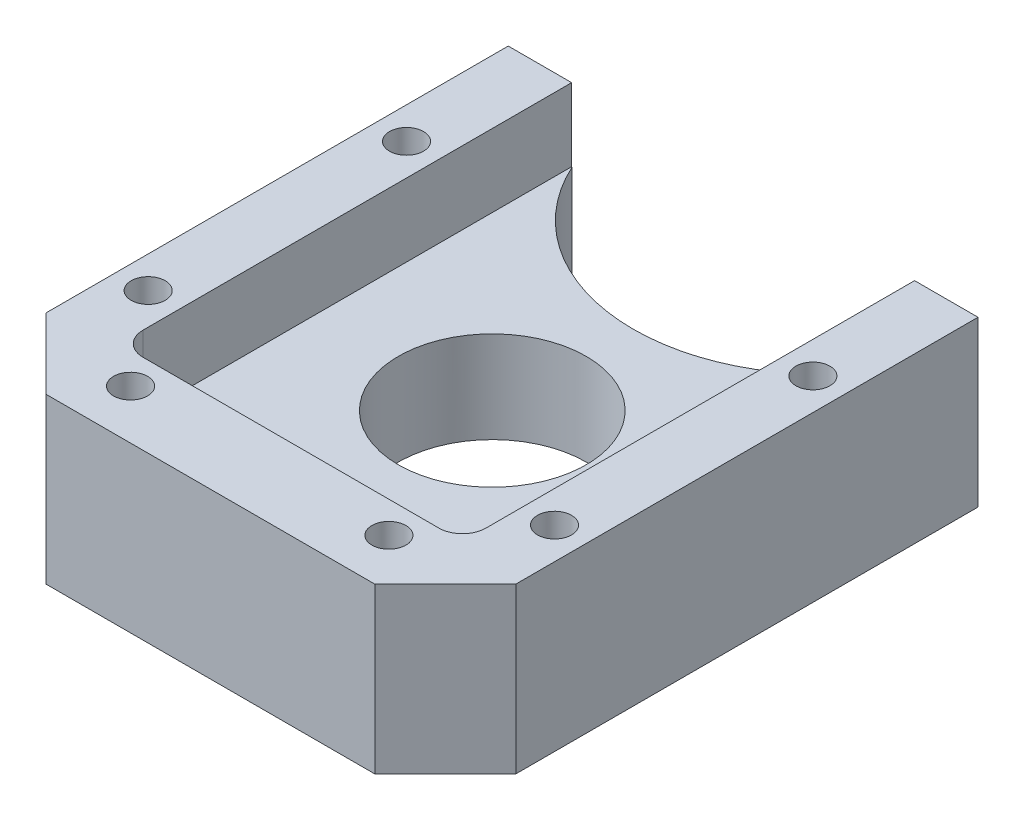
ISO-10303-21;
HEADER;
FILE_DESCRIPTION(('STEP AP214'),'2;1');
FILE_NAME('part.step','',(''),(''),'','','');
FILE_SCHEMA(('AUTOMOTIVE_DESIGN { 1 0 10303 214 1 1 1 1 }'));
ENDSEC;
DATA;
#1=APPLICATION_CONTEXT('core data for automotive mechanical design processes');
#2=APPLICATION_PROTOCOL_DEFINITION('international standard','automotive_design',2000,#1);
#3=PRODUCT_CONTEXT('',#1,'mechanical');
#4=PRODUCT('Part','Part','',(#3));
#5=PRODUCT_RELATED_PRODUCT_CATEGORY('part','',(#4));
#6=PRODUCT_DEFINITION_FORMATION('','',#4);
#7=PRODUCT_DEFINITION_CONTEXT('part definition',#1,'design');
#8=PRODUCT_DEFINITION('design','',#6,#7);
#9=PRODUCT_DEFINITION_SHAPE('','',#8);
#10=(LENGTH_UNIT() NAMED_UNIT(*) SI_UNIT(.MILLI.,.METRE.));
#11=(NAMED_UNIT(*) PLANE_ANGLE_UNIT() SI_UNIT($,.RADIAN.));
#12=(NAMED_UNIT(*) SI_UNIT($,.STERADIAN.) SOLID_ANGLE_UNIT());
#13=UNCERTAINTY_MEASURE_WITH_UNIT(LENGTH_MEASURE(1.E-05),#10,'distance_accuracy_value','');
#14=(GEOMETRIC_REPRESENTATION_CONTEXT(3) GLOBAL_UNCERTAINTY_ASSIGNED_CONTEXT((#13)) GLOBAL_UNIT_ASSIGNED_CONTEXT((#10,
#11,#12)) REPRESENTATION_CONTEXT('',''));
#15=CARTESIAN_POINT('',(0.,0.,0.));
#16=DIRECTION('',(0.,0.,1.));
#17=DIRECTION('',(1.,0.,0.));
#18=AXIS2_PLACEMENT_3D('',#15,#16,#17);
#19=CARTESIAN_POINT('',(0.,14.,-45.36));
#20=DIRECTION('',(0.,0.,-1.));
#21=DIRECTION('',(-1.,0.,0.));
#22=AXIS2_PLACEMENT_3D('',#19,#20,#21);
#23=PLANE('',#22);
#24=DIRECTION('',(0.,-1.,0.));
#25=VECTOR('',#24,1.);
#26=CARTESIAN_POINT('',(34.5571425767559,14.,-45.36));
#27=LINE('',#26,#25);
#28=CARTESIAN_POINT('',(34.5571425767559,7.8,-45.36));
#29=VERTEX_POINT('',#28);
#30=CARTESIAN_POINT('',(34.5571425767559,0.,-45.36));
#31=VERTEX_POINT('',#30);
#32=EDGE_CURVE('E147',#29,#31,#27,.T.);
#33=ORIENTED_EDGE('',*,*,#32,.F.);
#34=DIRECTION('',(-1.,0.,0.));
#35=VECTOR('',#34,1.);
#36=CARTESIAN_POINT('',(5.39999999999999,7.8,-45.36));
#37=LINE('',#36,#35);
#38=CARTESIAN_POINT('',(34.6,7.8,-45.36));
#39=VERTEX_POINT('',#38);
#40=EDGE_CURVE('E298',#39,#29,#37,.T.);
#41=ORIENTED_EDGE('',*,*,#40,.F.);
#42=DIRECTION('',(0.,1.,0.));
#43=VECTOR('',#42,1.);
#44=CARTESIAN_POINT('',(34.6,7.8,-45.36));
#45=LINE('',#44,#43);
#46=CARTESIAN_POINT('',(34.6,14.,-45.36));
#47=VERTEX_POINT('',#46);
#48=EDGE_CURVE('E183',#39,#47,#45,.T.);
#49=ORIENTED_EDGE('',*,*,#48,.T.);
#50=DIRECTION('',(1.,0.,0.));
#51=VECTOR('',#50,1.);
#52=CARTESIAN_POINT('',(0.,14.,-45.36));
#53=LINE('',#52,#51);
#54=CARTESIAN_POINT('',(40.,14.,-45.36));
#55=VERTEX_POINT('',#54);
#56=EDGE_CURVE('E199',#47,#55,#53,.T.);
#57=ORIENTED_EDGE('',*,*,#56,.T.);
#58=DIRECTION('',(0.,-1.,0.));
#59=VECTOR('',#58,1.);
#60=CARTESIAN_POINT('',(40.,14.,-45.36));
#61=LINE('',#60,#59);
#62=CARTESIAN_POINT('',(40.,0.,-45.36));
#63=VERTEX_POINT('',#62);
#64=EDGE_CURVE('E175',#55,#63,#61,.T.);
#65=ORIENTED_EDGE('',*,*,#64,.T.);
#66=DIRECTION('',(1.,0.,0.));
#67=VECTOR('',#66,1.);
#68=CARTESIAN_POINT('',(0.,0.,-45.36));
#69=LINE('',#68,#67);
#70=EDGE_CURVE('E167',#31,#63,#69,.T.);
#71=ORIENTED_EDGE('',*,*,#70,.F.);
#72=EDGE_LOOP('',(#33,#41,#49,#57,#65,#71));
#73=FACE_BOUND('',#72,.T.);
#74=ADVANCED_FACE('F46',(#73),#23,.T.);
#75=DIRECTION('',(0.,-1.,0.));
#76=VECTOR('',#75,1.);
#77=CARTESIAN_POINT('',(5.44285742324408,14.,-45.36));
#78=LINE('',#77,#76);
#79=CARTESIAN_POINT('',(5.44285742324408,0.,-45.36));
#80=VERTEX_POINT('',#79);
#81=CARTESIAN_POINT('',(5.44285742324408,7.8,-45.36));
#82=VERTEX_POINT('',#81);
#83=EDGE_CURVE('E160',#80,#82,#78,.F.);
#84=ORIENTED_EDGE('',*,*,#83,.F.);
#85=CARTESIAN_POINT('',(0.,0.,-45.36));
#86=VERTEX_POINT('',#85);
#87=EDGE_CURVE('E171',#86,#80,#69,.T.);
#88=ORIENTED_EDGE('',*,*,#87,.F.);
#89=DIRECTION('',(0.,-1.,0.));
#90=VECTOR('',#89,1.);
#91=CARTESIAN_POINT('',(0.,14.,-45.36));
#92=LINE('',#91,#90);
#93=CARTESIAN_POINT('',(0.,14.,-45.36));
#94=VERTEX_POINT('',#93);
#95=EDGE_CURVE('E200',#94,#86,#92,.T.);
#96=ORIENTED_EDGE('',*,*,#95,.F.);
#97=CARTESIAN_POINT('',(5.39999999999999,14.,-45.36));
#98=VERTEX_POINT('',#97);
#99=EDGE_CURVE('E308',#94,#98,#53,.T.);
#100=ORIENTED_EDGE('',*,*,#99,.T.);
#101=DIRECTION('',(0.,1.,0.));
#102=VECTOR('',#101,1.);
#103=CARTESIAN_POINT('',(5.39999999999999,7.8,-45.36));
#104=LINE('',#103,#102);
#105=CARTESIAN_POINT('',(5.39999999999999,7.8,-45.36));
#106=VERTEX_POINT('',#105);
#107=EDGE_CURVE('E178',#106,#98,#104,.T.);
#108=ORIENTED_EDGE('',*,*,#107,.F.);
#109=EDGE_CURVE('E292',#82,#106,#37,.T.);
#110=ORIENTED_EDGE('',*,*,#109,.F.);
#111=EDGE_LOOP('',(#84,#88,#96,#100,#108,#110));
#112=FACE_BOUND('',#111,.T.);
#113=ADVANCED_FACE('F348',(#112),#23,.T.);
#114=CARTESIAN_POINT('',(0.,14.,-45.36));
#115=DIRECTION('',(1.,0.,0.));
#116=DIRECTION('',(0.,0.,-1.));
#117=AXIS2_PLACEMENT_3D('',#114,#115,#116);
#118=PLANE('',#117);
#119=DIRECTION('',(0.,0.,1.));
#120=VECTOR('',#119,1.);
#121=CARTESIAN_POINT('',(0.,0.,-45.36));
#122=LINE('',#121,#120);
#123=CARTESIAN_POINT('',(0.,0.,-6.00000000000004));
#124=VERTEX_POINT('',#123);
#125=EDGE_CURVE('E195',#86,#124,#122,.T.);
#126=ORIENTED_EDGE('',*,*,#125,.T.);
#127=DIRECTION('',(0.,1.,0.));
#128=VECTOR('',#127,1.);
#129=CARTESIAN_POINT('',(0.,14.,-6.00000000000003));
#130=LINE('',#129,#128);
#131=CARTESIAN_POINT('',(0.,14.,-6.00000000000004));
#132=VERTEX_POINT('',#131);
#133=EDGE_CURVE('E235',#124,#132,#130,.T.);
#134=ORIENTED_EDGE('',*,*,#133,.T.);
#135=DIRECTION('',(0.,0.,1.));
#136=VECTOR('',#135,1.);
#137=CARTESIAN_POINT('',(0.,14.,-45.36));
#138=LINE('',#137,#136);
#139=EDGE_CURVE('E187',#94,#132,#138,.T.);
#140=ORIENTED_EDGE('',*,*,#139,.F.);
#141=ORIENTED_EDGE('',*,*,#95,.T.);
#142=EDGE_LOOP('',(#126,#134,#140,#141));
#143=FACE_BOUND('',#142,.T.);
#144=ADVANCED_FACE('F354',(#143),#118,.F.);
#145=CARTESIAN_POINT('',(0.,14.,0.));
#146=DIRECTION('',(0.,0.,-1.));
#147=DIRECTION('',(-1.,0.,0.));
#148=AXIS2_PLACEMENT_3D('',#145,#146,#147);
#149=PLANE('',#148);
#150=DIRECTION('',(1.,0.,0.));
#151=VECTOR('',#150,1.);
#152=CARTESIAN_POINT('',(0.,0.,0.));
#153=LINE('',#152,#151);
#154=CARTESIAN_POINT('',(6.,0.,0.));
#155=VERTEX_POINT('',#154);
#156=CARTESIAN_POINT('',(34.,0.,0.));
#157=VERTEX_POINT('',#156);
#158=EDGE_CURVE('E191',#155,#157,#153,.T.);
#159=ORIENTED_EDGE('',*,*,#158,.T.);
#160=DIRECTION('',(0.,1.,0.));
#161=VECTOR('',#160,1.);
#162=CARTESIAN_POINT('',(34.,14.,0.));
#163=LINE('',#162,#161);
#164=CARTESIAN_POINT('',(34.,14.,0.));
#165=VERTEX_POINT('',#164);
#166=EDGE_CURVE('E226',#157,#165,#163,.T.);
#167=ORIENTED_EDGE('',*,*,#166,.T.);
#168=DIRECTION('',(1.,0.,0.));
#169=VECTOR('',#168,1.);
#170=CARTESIAN_POINT('',(0.,14.,0.));
#171=LINE('',#170,#169);
#172=CARTESIAN_POINT('',(6.,14.,0.));
#173=VERTEX_POINT('',#172);
#174=EDGE_CURVE('E314',#173,#165,#171,.T.);
#175=ORIENTED_EDGE('',*,*,#174,.F.);
#176=DIRECTION('',(0.,-1.,0.));
#177=VECTOR('',#176,1.);
#178=CARTESIAN_POINT('',(6.,14.,0.));
#179=LINE('',#178,#177);
#180=EDGE_CURVE('E222',#173,#155,#179,.T.);
#181=ORIENTED_EDGE('',*,*,#180,.T.);
#182=EDGE_LOOP('',(#159,#167,#175,#181));
#183=FACE_BOUND('',#182,.T.);
#184=ADVANCED_FACE('F329',(#183),#149,.F.);
#185=CARTESIAN_POINT('',(40.,14.,-45.36));
#186=DIRECTION('',(1.,0.,0.));
#187=DIRECTION('',(0.,0.,-1.));
#188=AXIS2_PLACEMENT_3D('',#185,#186,#187);
#189=PLANE('',#188);
#190=DIRECTION('',(0.,0.,1.));
#191=VECTOR('',#190,1.);
#192=CARTESIAN_POINT('',(40.,14.,-45.36));
#193=LINE('',#192,#191);
#194=CARTESIAN_POINT('',(40.,14.,-6.00000000000002));
#195=VERTEX_POINT('',#194);
#196=EDGE_CURVE('E311',#55,#195,#193,.T.);
#197=ORIENTED_EDGE('',*,*,#196,.T.);
#198=DIRECTION('',(0.,-1.,0.));
#199=VECTOR('',#198,1.);
#200=CARTESIAN_POINT('',(40.,0.,-6.00000000000001));
#201=LINE('',#200,#199);
#202=CARTESIAN_POINT('',(40.,0.,-6.00000000000002));
#203=VERTEX_POINT('',#202);
#204=EDGE_CURVE('E212',#195,#203,#201,.T.);
#205=ORIENTED_EDGE('',*,*,#204,.T.);
#206=DIRECTION('',(0.,0.,1.));
#207=VECTOR('',#206,1.);
#208=CARTESIAN_POINT('',(40.,0.,-45.36));
#209=LINE('',#208,#207);
#210=EDGE_CURVE('E182',#63,#203,#209,.T.);
#211=ORIENTED_EDGE('',*,*,#210,.F.);
#212=ORIENTED_EDGE('',*,*,#64,.F.);
#213=EDGE_LOOP('',(#197,#205,#211,#212));
#214=FACE_BOUND('',#213,.T.);
#215=ADVANCED_FACE('F335',(#214),#189,.T.);
#216=CARTESIAN_POINT('',(0.,14.,0.));
#217=DIRECTION('',(0.,-1.,0.));
#218=DIRECTION('',(0.,0.,-1.));
#219=AXIS2_PLACEMENT_3D('',#216,#217,#218);
#220=PLANE('',#219);
#221=CARTESIAN_POINT('',(37.3,14.,-34.));
#222=DIRECTION('',(0.,-1.,0.));
#223=DIRECTION('',(0.,0.,-1.));
#224=AXIS2_PLACEMENT_3D('',#221,#222,#223);
#225=CIRCLE('',#224,1.45);
#226=CARTESIAN_POINT('',(37.3,14.,-35.45));
#227=VERTEX_POINT('',#226);
#228=EDGE_CURVE('E551',#227,#227,#225,.T.);
#229=ORIENTED_EDGE('',*,*,#228,.T.);
#230=EDGE_LOOP('',(#229));
#231=FACE_BOUND('',#230,.T.);
#232=CARTESIAN_POINT('',(37.3,14.,-12.));
#233=DIRECTION('',(0.,-1.,0.));
#234=DIRECTION('',(0.,0.,-1.));
#235=AXIS2_PLACEMENT_3D('',#232,#233,#234);
#236=CIRCLE('',#235,1.44999999999999);
#237=CARTESIAN_POINT('',(37.3,14.,-13.45));
#238=VERTEX_POINT('',#237);
#239=EDGE_CURVE('E559',#238,#238,#236,.T.);
#240=ORIENTED_EDGE('',*,*,#239,.T.);
#241=EDGE_LOOP('',(#240));
#242=FACE_BOUND('',#241,.T.);
#243=CARTESIAN_POINT('',(2.7,14.,-12.));
#244=DIRECTION('',(0.,-1.,0.));
#245=DIRECTION('',(0.,0.,-1.));
#246=AXIS2_PLACEMENT_3D('',#243,#244,#245);
#247=CIRCLE('',#246,1.45);
#248=CARTESIAN_POINT('',(2.7,14.,-13.45));
#249=VERTEX_POINT('',#248);
#250=EDGE_CURVE('E567',#249,#249,#247,.T.);
#251=ORIENTED_EDGE('',*,*,#250,.T.);
#252=EDGE_LOOP('',(#251));
#253=FACE_BOUND('',#252,.T.);
#254=CARTESIAN_POINT('',(2.69999999999999,14.,-34.));
#255=DIRECTION('',(0.,-1.,0.));
#256=DIRECTION('',(0.,0.,-1.));
#257=AXIS2_PLACEMENT_3D('',#254,#255,#256);
#258=CIRCLE('',#257,1.45);
#259=CARTESIAN_POINT('',(2.69999999999999,14.,-35.45));
#260=VERTEX_POINT('',#259);
#261=EDGE_CURVE('E575',#260,#260,#258,.T.);
#262=ORIENTED_EDGE('',*,*,#261,.T.);
#263=EDGE_LOOP('',(#262));
#264=FACE_BOUND('',#263,.T.);
#265=CARTESIAN_POINT('',(31.,14.,-4.2));
#266=DIRECTION('',(0.,-1.,0.));
#267=DIRECTION('',(0.,0.,-1.));
#268=AXIS2_PLACEMENT_3D('',#265,#266,#267);
#269=CIRCLE('',#268,1.44999999999999);
#270=CARTESIAN_POINT('',(31.,14.,-5.64999999999999));
#271=VERTEX_POINT('',#270);
#272=EDGE_CURVE('E583',#271,#271,#269,.T.);
#273=ORIENTED_EDGE('',*,*,#272,.T.);
#274=EDGE_LOOP('',(#273));
#275=FACE_BOUND('',#274,.T.);
#276=CARTESIAN_POINT('',(9.,14.,-4.2));
#277=DIRECTION('',(0.,-1.,0.));
#278=DIRECTION('',(0.,0.,-1.));
#279=AXIS2_PLACEMENT_3D('',#276,#277,#278);
#280=CIRCLE('',#279,1.45);
#281=CARTESIAN_POINT('',(9.,14.,-5.64999999999999));
#282=VERTEX_POINT('',#281);
#283=EDGE_CURVE('E276',#282,#282,#280,.T.);
#284=ORIENTED_EDGE('',*,*,#283,.T.);
#285=EDGE_LOOP('',(#284));
#286=FACE_BOUND('',#285,.T.);
#287=ORIENTED_EDGE('',*,*,#174,.T.);
#288=DIRECTION('',(0.707106781186549,0.,-0.707106781186546));
#289=VECTOR('',#288,1.);
#290=CARTESIAN_POINT('',(40.,14.,-6.00000000000001));
#291=LINE('',#290,#289);
#292=EDGE_CURVE('E232',#165,#195,#291,.T.);
#293=ORIENTED_EDGE('',*,*,#292,.T.);
#294=ORIENTED_EDGE('',*,*,#196,.F.);
#295=ORIENTED_EDGE('',*,*,#56,.F.);
#296=DIRECTION('',(0.,0.,-1.));
#297=VECTOR('',#296,1.);
#298=CARTESIAN_POINT('',(34.6,14.,-45.36));
#299=LINE('',#298,#297);
#300=CARTESIAN_POINT('',(34.6,14.,-8.86000000000001));
#301=VERTEX_POINT('',#300);
#302=EDGE_CURVE('E294',#301,#47,#299,.T.);
#303=ORIENTED_EDGE('',*,*,#302,.F.);
#304=CARTESIAN_POINT('',(32.6,14.,-8.86000000000001));
#305=DIRECTION('',(0.,-1.,0.));
#306=DIRECTION('',(0.,0.,-1.));
#307=AXIS2_PLACEMENT_3D('',#304,#305,#306);
#308=CIRCLE('',#307,2.);
#309=CARTESIAN_POINT('',(32.6,14.,-6.86));
#310=VERTEX_POINT('',#309);
#311=EDGE_CURVE('E11',#301,#310,#308,.T.);
#312=ORIENTED_EDGE('',*,*,#311,.T.);
#313=DIRECTION('',(1.,0.,0.));
#314=VECTOR('',#313,1.);
#315=CARTESIAN_POINT('',(5.4,14.,-6.86));
#316=LINE('',#315,#314);
#317=CARTESIAN_POINT('',(7.4,14.,-6.86));
#318=VERTEX_POINT('',#317);
#319=EDGE_CURVE('E266',#318,#310,#316,.T.);
#320=ORIENTED_EDGE('',*,*,#319,.F.);
#321=CARTESIAN_POINT('',(7.4,14.,-8.86));
#322=DIRECTION('',(0.,-1.,0.));
#323=DIRECTION('',(0.,0.,-1.));
#324=AXIS2_PLACEMENT_3D('',#321,#322,#323);
#325=CIRCLE('',#324,2.);
#326=CARTESIAN_POINT('',(5.4,14.,-8.86));
#327=VERTEX_POINT('',#326);
#328=EDGE_CURVE('E55',#318,#327,#325,.T.);
#329=ORIENTED_EDGE('',*,*,#328,.T.);
#330=DIRECTION('',(0.,0.,1.));
#331=VECTOR('',#330,1.);
#332=CARTESIAN_POINT('',(5.39999999999999,14.,-45.36));
#333=LINE('',#332,#331);
#334=EDGE_CURVE('E263',#98,#327,#333,.T.);
#335=ORIENTED_EDGE('',*,*,#334,.F.);
#336=ORIENTED_EDGE('',*,*,#99,.F.);
#337=ORIENTED_EDGE('',*,*,#139,.T.);
#338=DIRECTION('',(-0.707106781186546,0.,-0.707106781186549));
#339=VECTOR('',#338,1.);
#340=CARTESIAN_POINT('',(6.,14.,0.));
#341=LINE('',#340,#339);
#342=EDGE_CURVE('E229',#132,#173,#341,.F.);
#343=ORIENTED_EDGE('',*,*,#342,.T.);
#344=EDGE_LOOP('',(#287,#293,#294,#295,#303,#312,#320,#329,#335,#336,#337,#343));
#345=FACE_BOUND('',#344,.T.);
#346=ADVANCED_FACE('F261',(#231,#242,#253,#264,#275,#286,#345),#220,.F.);
#347=CARTESIAN_POINT('',(0.,0.,0.));
#348=DIRECTION('',(0.,-1.,0.));
#349=DIRECTION('',(0.,0.,-1.));
#350=AXIS2_PLACEMENT_3D('',#347,#348,#349);
#351=PLANE('',#350);
#352=ORIENTED_EDGE('',*,*,#210,.T.);
#353=DIRECTION('',(-0.707106781186549,0.,0.707106781186546));
#354=VECTOR('',#353,1.);
#355=CARTESIAN_POINT('',(16.9999999999999,0.,17.));
#356=LINE('',#355,#354);
#357=EDGE_CURVE('E219',#203,#157,#356,.T.);
#358=ORIENTED_EDGE('',*,*,#357,.T.);
#359=ORIENTED_EDGE('',*,*,#158,.F.);
#360=DIRECTION('',(0.707106781186546,0.,0.707106781186549));
#361=VECTOR('',#360,1.);
#362=CARTESIAN_POINT('',(3.00000000000001,0.,-3.));
#363=LINE('',#362,#361);
#364=EDGE_CURVE('E216',#155,#124,#363,.F.);
#365=ORIENTED_EDGE('',*,*,#364,.T.);
#366=ORIENTED_EDGE('',*,*,#125,.F.);
#367=ORIENTED_EDGE('',*,*,#87,.T.);
#368=CARTESIAN_POINT('',(20.,0.,-52.));
#369=DIRECTION('',(0.,-1.,0.));
#370=DIRECTION('',(0.,0.,-1.));
#371=AXIS2_PLACEMENT_3D('',#368,#369,#370);
#372=CIRCLE('',#371,16.);
#373=EDGE_CURVE('E150',#31,#80,#372,.T.);
#374=ORIENTED_EDGE('',*,*,#373,.F.);
#375=ORIENTED_EDGE('',*,*,#70,.T.);
#376=EDGE_LOOP('',(#352,#358,#359,#365,#366,#367,#374,#375));
#377=FACE_BOUND('',#376,.T.);
#378=CARTESIAN_POINT('',(20.,0.,-24.));
#379=DIRECTION('',(0.,-1.,0.));
#380=DIRECTION('',(0.,0.,-1.));
#381=AXIS2_PLACEMENT_3D('',#378,#379,#380);
#382=CIRCLE('',#381,8.);
#383=CARTESIAN_POINT('',(20.,0.,-32.));
#384=VERTEX_POINT('',#383);
#385=EDGE_CURVE('E159',#384,#384,#382,.T.);
#386=ORIENTED_EDGE('',*,*,#385,.F.);
#387=EDGE_LOOP('',(#386));
#388=FACE_BOUND('',#387,.T.);
#389=CARTESIAN_POINT('',(37.3,0.,-34.));
#390=DIRECTION('',(0.,-1.,0.));
#391=DIRECTION('',(0.,0.,-1.));
#392=AXIS2_PLACEMENT_3D('',#389,#390,#391);
#393=CIRCLE('',#392,1.45);
#394=CARTESIAN_POINT('',(37.3,0.,-35.45));
#395=VERTEX_POINT('',#394);
#396=EDGE_CURVE('E209',#395,#395,#393,.T.);
#397=ORIENTED_EDGE('',*,*,#396,.F.);
#398=EDGE_LOOP('',(#397));
#399=FACE_BOUND('',#398,.T.);
#400=CARTESIAN_POINT('',(37.3,0.,-12.));
#401=DIRECTION('',(0.,-1.,0.));
#402=DIRECTION('',(0.,0.,-1.));
#403=AXIS2_PLACEMENT_3D('',#400,#401,#402);
#404=CIRCLE('',#403,1.45);
#405=CARTESIAN_POINT('',(37.3,0.,-13.45));
#406=VERTEX_POINT('',#405);
#407=EDGE_CURVE('E555',#406,#406,#404,.T.);
#408=ORIENTED_EDGE('',*,*,#407,.F.);
#409=EDGE_LOOP('',(#408));
#410=FACE_BOUND('',#409,.T.);
#411=CARTESIAN_POINT('',(2.7,0.,-12.));
#412=DIRECTION('',(0.,-1.,0.));
#413=DIRECTION('',(0.,0.,-1.));
#414=AXIS2_PLACEMENT_3D('',#411,#412,#413);
#415=CIRCLE('',#414,1.45);
#416=CARTESIAN_POINT('',(2.7,0.,-13.45));
#417=VERTEX_POINT('',#416);
#418=EDGE_CURVE('E563',#417,#417,#415,.T.);
#419=ORIENTED_EDGE('',*,*,#418,.F.);
#420=EDGE_LOOP('',(#419));
#421=FACE_BOUND('',#420,.T.);
#422=CARTESIAN_POINT('',(2.69999999999999,0.,-34.));
#423=DIRECTION('',(0.,-1.,0.));
#424=DIRECTION('',(0.,0.,-1.));
#425=AXIS2_PLACEMENT_3D('',#422,#423,#424);
#426=CIRCLE('',#425,1.45);
#427=CARTESIAN_POINT('',(2.69999999999999,0.,-35.45));
#428=VERTEX_POINT('',#427);
#429=EDGE_CURVE('E571',#428,#428,#426,.T.);
#430=ORIENTED_EDGE('',*,*,#429,.F.);
#431=EDGE_LOOP('',(#430));
#432=FACE_BOUND('',#431,.T.);
#433=CARTESIAN_POINT('',(31.,0.,-4.2));
#434=DIRECTION('',(0.,-1.,0.));
#435=DIRECTION('',(0.,0.,-1.));
#436=AXIS2_PLACEMENT_3D('',#433,#434,#435);
#437=CIRCLE('',#436,1.45);
#438=CARTESIAN_POINT('',(31.,0.,-5.65));
#439=VERTEX_POINT('',#438);
#440=EDGE_CURVE('E579',#439,#439,#437,.T.);
#441=ORIENTED_EDGE('',*,*,#440,.F.);
#442=EDGE_LOOP('',(#441));
#443=FACE_BOUND('',#442,.T.);
#444=CARTESIAN_POINT('',(9.,0.,-4.2));
#445=DIRECTION('',(0.,-1.,0.));
#446=DIRECTION('',(0.,0.,-1.));
#447=AXIS2_PLACEMENT_3D('',#444,#445,#446);
#448=CIRCLE('',#447,1.45);
#449=CARTESIAN_POINT('',(9.,0.,-5.65));
#450=VERTEX_POINT('',#449);
#451=EDGE_CURVE('E587',#450,#450,#448,.T.);
#452=ORIENTED_EDGE('',*,*,#451,.F.);
#453=EDGE_LOOP('',(#452));
#454=FACE_BOUND('',#453,.T.);
#455=ADVANCED_FACE('F165',(#377,#388,#399,#410,#421,#432,#443,#454),#351,.T.);
#456=CARTESIAN_POINT('',(5.39999999999999,7.8,-45.36));
#457=DIRECTION('',(-1.,0.,0.));
#458=DIRECTION('',(0.,0.,1.));
#459=AXIS2_PLACEMENT_3D('',#456,#457,#458);
#460=PLANE('',#459);
#461=ORIENTED_EDGE('',*,*,#334,.T.);
#462=DIRECTION('',(0.,1.,0.));
#463=VECTOR('',#462,1.);
#464=CARTESIAN_POINT('',(5.4,7.8,-8.86));
#465=LINE('',#464,#463);
#466=CARTESIAN_POINT('',(5.4,7.8,-8.86));
#467=VERTEX_POINT('',#466);
#468=EDGE_CURVE('E245',#327,#467,#465,.F.);
#469=ORIENTED_EDGE('',*,*,#468,.T.);
#470=DIRECTION('',(0.,0.,1.));
#471=VECTOR('',#470,1.);
#472=CARTESIAN_POINT('',(5.39999999999999,7.8,-45.36));
#473=LINE('',#472,#471);
#474=EDGE_CURVE('E284',#106,#467,#473,.T.);
#475=ORIENTED_EDGE('',*,*,#474,.F.);
#476=ORIENTED_EDGE('',*,*,#107,.T.);
#477=EDGE_LOOP('',(#461,#469,#475,#476));
#478=FACE_BOUND('',#477,.T.);
#479=ADVANCED_FACE('F271',(#478),#460,.F.);
#480=CARTESIAN_POINT('',(34.6,7.8,-45.36));
#481=DIRECTION('',(1.,0.,0.));
#482=DIRECTION('',(0.,0.,-1.));
#483=AXIS2_PLACEMENT_3D('',#480,#481,#482);
#484=PLANE('',#483);
#485=DIRECTION('',(0.,0.,-1.));
#486=VECTOR('',#485,1.);
#487=CARTESIAN_POINT('',(34.6,7.8,-45.36));
#488=LINE('',#487,#486);
#489=CARTESIAN_POINT('',(34.6,7.8,-8.86000000000001));
#490=VERTEX_POINT('',#489);
#491=EDGE_CURVE('E288',#490,#39,#488,.T.);
#492=ORIENTED_EDGE('',*,*,#491,.F.);
#493=DIRECTION('',(0.,1.,0.));
#494=VECTOR('',#493,1.);
#495=CARTESIAN_POINT('',(34.6,14.,-8.86000000000001));
#496=LINE('',#495,#494);
#497=EDGE_CURVE('E253',#490,#301,#496,.T.);
#498=ORIENTED_EDGE('',*,*,#497,.T.);
#499=ORIENTED_EDGE('',*,*,#302,.T.);
#500=ORIENTED_EDGE('',*,*,#48,.F.);
#501=EDGE_LOOP('',(#492,#498,#499,#500));
#502=FACE_BOUND('',#501,.T.);
#503=ADVANCED_FACE('F342',(#502),#484,.F.);
#504=CARTESIAN_POINT('',(5.4,7.8,-6.86));
#505=DIRECTION('',(0.,0.,1.));
#506=DIRECTION('',(1.,0.,0.));
#507=AXIS2_PLACEMENT_3D('',#504,#505,#506);
#508=PLANE('',#507);
#509=DIRECTION('',(1.,0.,0.));
#510=VECTOR('',#509,1.);
#511=CARTESIAN_POINT('',(5.4,7.8,-6.86));
#512=LINE('',#511,#510);
#513=CARTESIAN_POINT('',(7.4,7.8,-6.86));
#514=VERTEX_POINT('',#513);
#515=CARTESIAN_POINT('',(32.6,7.8,-6.86));
#516=VERTEX_POINT('',#515);
#517=EDGE_CURVE('E283',#514,#516,#512,.T.);
#518=ORIENTED_EDGE('',*,*,#517,.F.);
#519=DIRECTION('',(0.,1.,0.));
#520=VECTOR('',#519,1.);
#521=CARTESIAN_POINT('',(7.4,14.,-6.86));
#522=LINE('',#521,#520);
#523=EDGE_CURVE('E241',#514,#318,#522,.T.);
#524=ORIENTED_EDGE('',*,*,#523,.T.);
#525=ORIENTED_EDGE('',*,*,#319,.T.);
#526=DIRECTION('',(0.,1.,0.));
#527=VECTOR('',#526,1.);
#528=CARTESIAN_POINT('',(32.6,7.8,-6.86));
#529=LINE('',#528,#527);
#530=EDGE_CURVE('E238',#310,#516,#529,.F.);
#531=ORIENTED_EDGE('',*,*,#530,.T.);
#532=EDGE_LOOP('',(#518,#524,#525,#531));
#533=FACE_BOUND('',#532,.T.);
#534=ADVANCED_FACE('F286',(#533),#508,.F.);
#535=CARTESIAN_POINT('',(0.,7.8,0.));
#536=DIRECTION('',(0.,1.,0.));
#537=DIRECTION('',(0.,0.,1.));
#538=AXIS2_PLACEMENT_3D('',#535,#536,#537);
#539=PLANE('',#538);
#540=ORIENTED_EDGE('',*,*,#474,.T.);
#541=CARTESIAN_POINT('',(7.4,7.8,-8.86));
#542=DIRECTION('',(0.,1.,0.));
#543=DIRECTION('',(0.,0.,1.));
#544=AXIS2_PLACEMENT_3D('',#541,#542,#543);
#545=CIRCLE('',#544,2.);
#546=EDGE_CURVE('E250',#467,#514,#545,.T.);
#547=ORIENTED_EDGE('',*,*,#546,.T.);
#548=ORIENTED_EDGE('',*,*,#517,.T.);
#549=CARTESIAN_POINT('',(32.6,7.8,-8.86000000000001));
#550=DIRECTION('',(0.,1.,0.));
#551=DIRECTION('',(0.,0.,1.));
#552=AXIS2_PLACEMENT_3D('',#549,#550,#551);
#553=CIRCLE('',#552,2.);
#554=EDGE_CURVE('E68',#516,#490,#553,.T.);
#555=ORIENTED_EDGE('',*,*,#554,.T.);
#556=ORIENTED_EDGE('',*,*,#491,.T.);
#557=ORIENTED_EDGE('',*,*,#40,.T.);
#558=CARTESIAN_POINT('',(20.,7.8,-52.));
#559=DIRECTION('',(0.,1.,0.));
#560=DIRECTION('',(0.,0.,1.));
#561=AXIS2_PLACEMENT_3D('',#558,#559,#560);
#562=CIRCLE('',#561,16.);
#563=EDGE_CURVE('E153',#82,#29,#562,.T.);
#564=ORIENTED_EDGE('',*,*,#563,.F.);
#565=ORIENTED_EDGE('',*,*,#109,.T.);
#566=EDGE_LOOP('',(#540,#547,#548,#555,#556,#557,#564,#565));
#567=FACE_BOUND('',#566,.T.);
#568=CARTESIAN_POINT('',(20.,7.8,-24.));
#569=DIRECTION('',(0.,1.,0.));
#570=DIRECTION('',(0.,0.,1.));
#571=AXIS2_PLACEMENT_3D('',#568,#569,#570);
#572=CIRCLE('',#571,8.);
#573=CARTESIAN_POINT('',(20.,7.8,-16.));
#574=VERTEX_POINT('',#573);
#575=EDGE_CURVE('E205',#574,#574,#572,.T.);
#576=ORIENTED_EDGE('',*,*,#575,.F.);
#577=EDGE_LOOP('',(#576));
#578=FACE_BOUND('',#577,.T.);
#579=ADVANCED_FACE('F281',(#567,#578),#539,.T.);
#580=CARTESIAN_POINT('',(9.,0.,-4.2));
#581=DIRECTION('',(0.,-1.,0.));
#582=DIRECTION('',(0.,0.,-1.));
#583=AXIS2_PLACEMENT_3D('',#580,#581,#582);
#584=CYLINDRICAL_SURFACE('',#583,1.45);
#585=ORIENTED_EDGE('',*,*,#283,.F.);
#586=EDGE_LOOP('',(#585));
#587=FACE_BOUND('',#586,.T.);
#588=ORIENTED_EDGE('',*,*,#451,.T.);
#589=EDGE_LOOP('',(#588));
#590=FACE_BOUND('',#589,.T.);
#591=ADVANCED_FACE('F411',(#587,#590),#584,.F.);
#592=CARTESIAN_POINT('',(31.,0.,-4.2));
#593=DIRECTION('',(0.,-1.,0.));
#594=DIRECTION('',(0.,0.,-1.));
#595=AXIS2_PLACEMENT_3D('',#592,#593,#594);
#596=CYLINDRICAL_SURFACE('',#595,1.45);
#597=ORIENTED_EDGE('',*,*,#272,.F.);
#598=EDGE_LOOP('',(#597));
#599=FACE_BOUND('',#598,.T.);
#600=ORIENTED_EDGE('',*,*,#440,.T.);
#601=EDGE_LOOP('',(#600));
#602=FACE_BOUND('',#601,.T.);
#603=ADVANCED_FACE('F483',(#599,#602),#596,.F.);
#604=CARTESIAN_POINT('',(2.69999999999999,0.,-34.));
#605=DIRECTION('',(0.,-1.,0.));
#606=DIRECTION('',(0.,0.,-1.));
#607=AXIS2_PLACEMENT_3D('',#604,#605,#606);
#608=CYLINDRICAL_SURFACE('',#607,1.45);
#609=ORIENTED_EDGE('',*,*,#261,.F.);
#610=EDGE_LOOP('',(#609));
#611=FACE_BOUND('',#610,.T.);
#612=ORIENTED_EDGE('',*,*,#429,.T.);
#613=EDGE_LOOP('',(#612));
#614=FACE_BOUND('',#613,.T.);
#615=ADVANCED_FACE('F474',(#611,#614),#608,.F.);
#616=CARTESIAN_POINT('',(2.7,0.,-12.));
#617=DIRECTION('',(0.,-1.,0.));
#618=DIRECTION('',(0.,0.,-1.));
#619=AXIS2_PLACEMENT_3D('',#616,#617,#618);
#620=CYLINDRICAL_SURFACE('',#619,1.45);
#621=ORIENTED_EDGE('',*,*,#250,.F.);
#622=EDGE_LOOP('',(#621));
#623=FACE_BOUND('',#622,.T.);
#624=ORIENTED_EDGE('',*,*,#418,.T.);
#625=EDGE_LOOP('',(#624));
#626=FACE_BOUND('',#625,.T.);
#627=ADVANCED_FACE('F465',(#623,#626),#620,.F.);
#628=CARTESIAN_POINT('',(37.3,0.,-12.));
#629=DIRECTION('',(0.,-1.,0.));
#630=DIRECTION('',(0.,0.,-1.));
#631=AXIS2_PLACEMENT_3D('',#628,#629,#630);
#632=CYLINDRICAL_SURFACE('',#631,1.45);
#633=ORIENTED_EDGE('',*,*,#239,.F.);
#634=EDGE_LOOP('',(#633));
#635=FACE_BOUND('',#634,.T.);
#636=ORIENTED_EDGE('',*,*,#407,.T.);
#637=EDGE_LOOP('',(#636));
#638=FACE_BOUND('',#637,.T.);
#639=ADVANCED_FACE('F456',(#635,#638),#632,.F.);
#640=CARTESIAN_POINT('',(37.3,0.,-34.));
#641=DIRECTION('',(0.,-1.,0.));
#642=DIRECTION('',(0.,0.,-1.));
#643=AXIS2_PLACEMENT_3D('',#640,#641,#642);
#644=CYLINDRICAL_SURFACE('',#643,1.45);
#645=ORIENTED_EDGE('',*,*,#228,.F.);
#646=EDGE_LOOP('',(#645));
#647=FACE_BOUND('',#646,.T.);
#648=ORIENTED_EDGE('',*,*,#396,.T.);
#649=EDGE_LOOP('',(#648));
#650=FACE_BOUND('',#649,.T.);
#651=ADVANCED_FACE('F447',(#647,#650),#644,.F.);
#652=CARTESIAN_POINT('',(20.,0.,-24.));
#653=DIRECTION('',(0.,-1.,0.));
#654=DIRECTION('',(0.,0.,-1.));
#655=AXIS2_PLACEMENT_3D('',#652,#653,#654);
#656=CYLINDRICAL_SURFACE('',#655,8.);
#657=ORIENTED_EDGE('',*,*,#575,.T.);
#658=EDGE_LOOP('',(#657));
#659=FACE_BOUND('',#658,.T.);
#660=ORIENTED_EDGE('',*,*,#385,.T.);
#661=EDGE_LOOP('',(#660));
#662=FACE_BOUND('',#661,.T.);
#663=ADVANCED_FACE('F435',(#659,#662),#656,.F.);
#664=CARTESIAN_POINT('',(20.,14.,-52.));
#665=DIRECTION('',(0.,-1.,0.));
#666=DIRECTION('',(0.,0.,-1.));
#667=AXIS2_PLACEMENT_3D('',#664,#665,#666);
#668=CYLINDRICAL_SURFACE('',#667,16.);
#669=ORIENTED_EDGE('',*,*,#32,.T.);
#670=ORIENTED_EDGE('',*,*,#373,.T.);
#671=ORIENTED_EDGE('',*,*,#83,.T.);
#672=ORIENTED_EDGE('',*,*,#563,.T.);
#673=EDGE_LOOP('',(#669,#670,#671,#672));
#674=FACE_BOUND('',#673,.T.);
#675=ADVANCED_FACE('F149',(#674),#668,.F.);
#676=CARTESIAN_POINT('',(40.,14.,-6.00000000000001));
#677=DIRECTION('',(0.707106781186546,0.,0.707106781186549));
#678=DIRECTION('',(0.,1.,0.));
#679=AXIS2_PLACEMENT_3D('',#676,#677,#678);
#680=PLANE('',#679);
#681=ORIENTED_EDGE('',*,*,#292,.F.);
#682=ORIENTED_EDGE('',*,*,#166,.F.);
#683=ORIENTED_EDGE('',*,*,#357,.F.);
#684=ORIENTED_EDGE('',*,*,#204,.F.);
#685=EDGE_LOOP('',(#681,#682,#683,#684));
#686=FACE_BOUND('',#685,.T.);
#687=ADVANCED_FACE('F333',(#686),#680,.T.);
#688=CARTESIAN_POINT('',(6.,14.,0.));
#689=DIRECTION('',(0.707106781186549,0.,-0.707106781186546));
#690=DIRECTION('',(0.,-1.,0.));
#691=AXIS2_PLACEMENT_3D('',#688,#689,#690);
#692=PLANE('',#691);
#693=ORIENTED_EDGE('',*,*,#342,.F.);
#694=ORIENTED_EDGE('',*,*,#133,.F.);
#695=ORIENTED_EDGE('',*,*,#364,.F.);
#696=ORIENTED_EDGE('',*,*,#180,.F.);
#697=EDGE_LOOP('',(#693,#694,#695,#696));
#698=FACE_BOUND('',#697,.T.);
#699=ADVANCED_FACE('F326',(#698),#692,.F.);
#700=CARTESIAN_POINT('',(7.4,7.8,-8.86));
#701=DIRECTION('',(0.,-1.,0.));
#702=DIRECTION('',(0.,0.,-1.));
#703=AXIS2_PLACEMENT_3D('',#700,#701,#702);
#704=CYLINDRICAL_SURFACE('',#703,2.);
#705=ORIENTED_EDGE('',*,*,#546,.F.);
#706=ORIENTED_EDGE('',*,*,#468,.F.);
#707=ORIENTED_EDGE('',*,*,#328,.F.);
#708=ORIENTED_EDGE('',*,*,#523,.F.);
#709=EDGE_LOOP('',(#705,#706,#707,#708));
#710=FACE_BOUND('',#709,.T.);
#711=ADVANCED_FACE('F279',(#710),#704,.F.);
#712=CARTESIAN_POINT('',(32.6,7.8,-8.86000000000001));
#713=DIRECTION('',(0.,-1.,0.));
#714=DIRECTION('',(0.,0.,-1.));
#715=AXIS2_PLACEMENT_3D('',#712,#713,#714);
#716=CYLINDRICAL_SURFACE('',#715,2.);
#717=ORIENTED_EDGE('',*,*,#554,.F.);
#718=ORIENTED_EDGE('',*,*,#530,.F.);
#719=ORIENTED_EDGE('',*,*,#311,.F.);
#720=ORIENTED_EDGE('',*,*,#497,.F.);
#721=EDGE_LOOP('',(#717,#718,#719,#720));
#722=FACE_BOUND('',#721,.T.);
#723=ADVANCED_FACE('F48',(#722),#716,.F.);
#724=CLOSED_SHELL('',(#74,#113,#144,#184,#215,#346,#455,#479,#503,#534,#579,#591,#603,#615,#627,
#639,#651,#663,#675,#687,#699,#711,#723));
#725=MANIFOLD_SOLID_BREP('B2',#724);
#726=ADVANCED_BREP_SHAPE_REPRESENTATION('',(#18,#725),#14);
#727=SHAPE_DEFINITION_REPRESENTATION(#9,#726);
ENDSEC;
END-ISO-10303-21;
